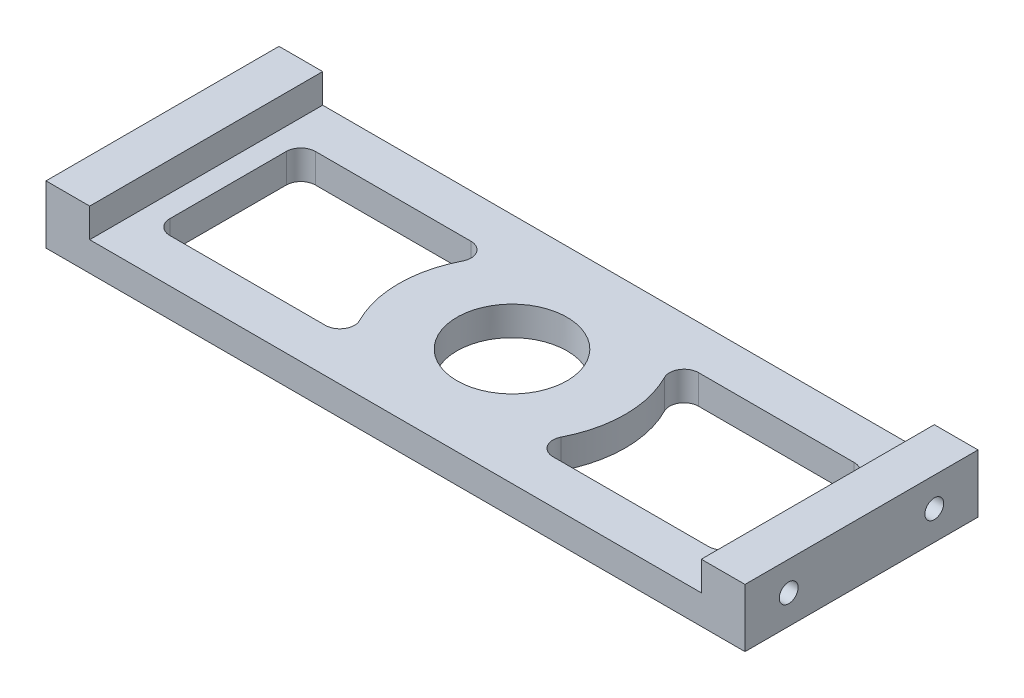
ISO-10303-21;
HEADER;
FILE_DESCRIPTION(('STEP AP214'),'2;1');
FILE_NAME('part.step','',(''),(''),'','','');
FILE_SCHEMA(('AUTOMOTIVE_DESIGN { 1 0 10303 214 1 1 1 1 }'));
ENDSEC;
DATA;
#1=APPLICATION_CONTEXT('core data for automotive mechanical design processes');
#2=APPLICATION_PROTOCOL_DEFINITION('international standard','automotive_design',2000,#1);
#3=PRODUCT_CONTEXT('',#1,'mechanical');
#4=PRODUCT('Part','Part','',(#3));
#5=PRODUCT_RELATED_PRODUCT_CATEGORY('part','',(#4));
#6=PRODUCT_DEFINITION_FORMATION('','',#4);
#7=PRODUCT_DEFINITION_CONTEXT('part definition',#1,'design');
#8=PRODUCT_DEFINITION('design','',#6,#7);
#9=PRODUCT_DEFINITION_SHAPE('','',#8);
#10=(LENGTH_UNIT() NAMED_UNIT(*) SI_UNIT(.MILLI.,.METRE.));
#11=(NAMED_UNIT(*) PLANE_ANGLE_UNIT() SI_UNIT($,.RADIAN.));
#12=(NAMED_UNIT(*) SI_UNIT($,.STERADIAN.) SOLID_ANGLE_UNIT());
#13=UNCERTAINTY_MEASURE_WITH_UNIT(LENGTH_MEASURE(1.E-05),#10,'distance_accuracy_value','');
#14=(GEOMETRIC_REPRESENTATION_CONTEXT(3) GLOBAL_UNCERTAINTY_ASSIGNED_CONTEXT((#13)) GLOBAL_UNIT_ASSIGNED_CONTEXT((#10,
#11,#12)) REPRESENTATION_CONTEXT('',''));
#15=CARTESIAN_POINT('',(0.,0.,0.));
#16=DIRECTION('',(0.,0.,1.));
#17=DIRECTION('',(1.,0.,0.));
#18=AXIS2_PLACEMENT_3D('',#15,#16,#17);
#19=CARTESIAN_POINT('',(0.,1.5875,0.));
#20=DIRECTION('',(0.,-1.,0.));
#21=DIRECTION('',(0.,0.,-1.));
#22=AXIS2_PLACEMENT_3D('',#19,#20,#21);
#23=PLANE('',#22);
#24=DIRECTION('',(1.,0.,0.));
#25=VECTOR('',#24,1.);
#26=CARTESIAN_POINT('',(-38.1,1.5875,12.7));
#27=LINE('',#26,#25);
#28=CARTESIAN_POINT('',(-33.3375,1.5875,12.7));
#29=VERTEX_POINT('',#28);
#30=CARTESIAN_POINT('',(33.3375,1.5875,12.7));
#31=VERTEX_POINT('',#30);
#32=EDGE_CURVE('E322',#29,#31,#27,.T.);
#33=ORIENTED_EDGE('',*,*,#32,.T.);
#34=DIRECTION('',(0.,0.,-1.));
#35=VECTOR('',#34,1.);
#36=CARTESIAN_POINT('',(33.3375,1.5875,-12.7));
#37=LINE('',#36,#35);
#38=CARTESIAN_POINT('',(33.3375,1.5875,-12.7));
#39=VERTEX_POINT('',#38);
#40=EDGE_CURVE('E257',#31,#39,#37,.T.);
#41=ORIENTED_EDGE('',*,*,#40,.T.);
#42=DIRECTION('',(1.,0.,0.));
#43=VECTOR('',#42,1.);
#44=CARTESIAN_POINT('',(-38.1,1.5875,-12.7));
#45=LINE('',#44,#43);
#46=CARTESIAN_POINT('',(-33.3375,1.5875,-12.7));
#47=VERTEX_POINT('',#46);
#48=EDGE_CURVE('E318',#47,#39,#45,.T.);
#49=ORIENTED_EDGE('',*,*,#48,.F.);
#50=DIRECTION('',(0.,0.,-1.));
#51=VECTOR('',#50,1.);
#52=CARTESIAN_POINT('',(-33.3375,1.5875,-12.7));
#53=LINE('',#52,#51);
#54=EDGE_CURVE('E283',#29,#47,#53,.T.);
#55=ORIENTED_EDGE('',*,*,#54,.F.);
#56=EDGE_LOOP('',(#33,#41,#49,#55));
#57=FACE_BOUND('',#56,.T.);
#58=CARTESIAN_POINT('',(0.,1.5875,0.));
#59=DIRECTION('',(0.,1.,0.));
#60=DIRECTION('',(0.,0.,1.));
#61=AXIS2_PLACEMENT_3D('',#58,#59,#60);
#62=CIRCLE('',#61,5.99999999999999);
#63=CARTESIAN_POINT('',(0.,1.5875,5.99999999999999));
#64=VERTEX_POINT('',#63);
#65=EDGE_CURVE('E309',#64,#64,#62,.T.);
#66=ORIENTED_EDGE('',*,*,#65,.F.);
#67=EDGE_LOOP('',(#66));
#68=FACE_BOUND('',#67,.T.);
#69=DIRECTION('',(0.,0.,1.));
#70=VECTOR('',#69,1.);
#71=CARTESIAN_POINT('',(-30.95625,1.5875,-7.9375));
#72=LINE('',#71,#70);
#73=CARTESIAN_POINT('',(-30.95625,1.5875,-6.35));
#74=VERTEX_POINT('',#73);
#75=CARTESIAN_POINT('',(-30.95625,1.5875,6.35));
#76=VERTEX_POINT('',#75);
#77=EDGE_CURVE('E456',#74,#76,#72,.T.);
#78=ORIENTED_EDGE('',*,*,#77,.F.);
#79=CARTESIAN_POINT('',(-29.36875,1.5875,-6.35));
#80=DIRECTION('',(0.,-1.,0.));
#81=DIRECTION('',(0.,0.,-1.));
#82=AXIS2_PLACEMENT_3D('',#79,#80,#81);
#83=CIRCLE('',#82,1.5875);
#84=CARTESIAN_POINT('',(-29.36875,1.5875,-7.9375));
#85=VERTEX_POINT('',#84);
#86=EDGE_CURVE('E51',#74,#85,#83,.T.);
#87=ORIENTED_EDGE('',*,*,#86,.T.);
#88=DIRECTION('',(-1.,0.,0.));
#89=VECTOR('',#88,1.);
#90=CARTESIAN_POINT('',(-30.95625,1.5875,-7.9375));
#91=LINE('',#90,#89);
#92=CARTESIAN_POINT('',(-12.4069096172254,1.5875,-7.9375));
#93=VERTEX_POINT('',#92);
#94=EDGE_CURVE('E455',#93,#85,#91,.T.);
#95=ORIENTED_EDGE('',*,*,#94,.F.);
#96=CARTESIAN_POINT('',(-12.4069096172254,1.5875,-6.35));
#97=DIRECTION('',(0.,-1.,0.));
#98=DIRECTION('',(0.,0.,-1.));
#99=AXIS2_PLACEMENT_3D('',#96,#97,#98);
#100=CIRCLE('',#99,1.5875);
#101=CARTESIAN_POINT('',(-10.9937459209136,1.5875,-5.6267264573991));
#102=VERTEX_POINT('',#101);
#103=EDGE_CURVE('E408',#93,#102,#100,.T.);
#104=ORIENTED_EDGE('',*,*,#103,.T.);
#105=CARTESIAN_POINT('',(0.,1.5875,0.));
#106=DIRECTION('',(0.,-1.,0.));
#107=DIRECTION('',(0.,0.,1.));
#108=AXIS2_PLACEMENT_3D('',#105,#106,#107);
#109=CIRCLE('',#108,12.35);
#110=CARTESIAN_POINT('',(-10.9937459209136,1.5875,5.6267264573991));
#111=VERTEX_POINT('',#110);
#112=EDGE_CURVE('E478',#111,#102,#109,.T.);
#113=ORIENTED_EDGE('',*,*,#112,.F.);
#114=CARTESIAN_POINT('',(-12.4069096172254,1.5875,6.35));
#115=DIRECTION('',(0.,-1.,0.));
#116=DIRECTION('',(0.,0.,-1.));
#117=AXIS2_PLACEMENT_3D('',#114,#115,#116);
#118=CIRCLE('',#117,1.5875);
#119=CARTESIAN_POINT('',(-12.4069096172254,1.5875,7.9375));
#120=VERTEX_POINT('',#119);
#121=EDGE_CURVE('E414',#111,#120,#118,.T.);
#122=ORIENTED_EDGE('',*,*,#121,.T.);
#123=DIRECTION('',(1.,0.,0.));
#124=VECTOR('',#123,1.);
#125=CARTESIAN_POINT('',(-30.95625,1.5875,7.9375));
#126=LINE('',#125,#124);
#127=CARTESIAN_POINT('',(-29.36875,1.5875,7.9375));
#128=VERTEX_POINT('',#127);
#129=EDGE_CURVE('E487',#128,#120,#126,.T.);
#130=ORIENTED_EDGE('',*,*,#129,.F.);
#131=CARTESIAN_POINT('',(-29.36875,1.5875,6.35));
#132=DIRECTION('',(0.,-1.,0.));
#133=DIRECTION('',(0.,0.,-1.));
#134=AXIS2_PLACEMENT_3D('',#131,#132,#133);
#135=CIRCLE('',#134,1.5875);
#136=EDGE_CURVE('E444',#128,#76,#135,.T.);
#137=ORIENTED_EDGE('',*,*,#136,.T.);
#138=EDGE_LOOP('',(#78,#87,#95,#104,#113,#122,#130,#137));
#139=FACE_BOUND('',#138,.T.);
#140=CARTESIAN_POINT('',(0.,1.5875,0.));
#141=DIRECTION('',(0.,1.,0.));
#142=DIRECTION('',(0.,0.,1.));
#143=AXIS2_PLACEMENT_3D('',#140,#141,#142);
#144=CIRCLE('',#143,12.35);
#145=CARTESIAN_POINT('',(10.9937459209136,1.5875,5.6267264573991));
#146=VERTEX_POINT('',#145);
#147=CARTESIAN_POINT('',(10.9937459209136,1.5875,-5.6267264573991));
#148=VERTEX_POINT('',#147);
#149=EDGE_CURVE('E602',#146,#148,#144,.T.);
#150=ORIENTED_EDGE('',*,*,#149,.T.);
#151=CARTESIAN_POINT('',(12.4069096172254,1.5875,-6.35));
#152=DIRECTION('',(0.,-1.,0.));
#153=DIRECTION('',(0.,0.,-1.));
#154=AXIS2_PLACEMENT_3D('',#151,#152,#153);
#155=CIRCLE('',#154,1.5875);
#156=CARTESIAN_POINT('',(12.4069096172254,1.5875,-7.9375));
#157=VERTEX_POINT('',#156);
#158=EDGE_CURVE('E432',#148,#157,#155,.T.);
#159=ORIENTED_EDGE('',*,*,#158,.T.);
#160=DIRECTION('',(1.,0.,0.));
#161=VECTOR('',#160,1.);
#162=CARTESIAN_POINT('',(30.95625,1.5875,-7.9375));
#163=LINE('',#162,#161);
#164=CARTESIAN_POINT('',(29.36875,1.5875,-7.9375));
#165=VERTEX_POINT('',#164);
#166=EDGE_CURVE('E598',#157,#165,#163,.T.);
#167=ORIENTED_EDGE('',*,*,#166,.T.);
#168=CARTESIAN_POINT('',(29.36875,1.5875,-6.35));
#169=DIRECTION('',(0.,-1.,0.));
#170=DIRECTION('',(0.,0.,-1.));
#171=AXIS2_PLACEMENT_3D('',#168,#169,#170);
#172=CIRCLE('',#171,1.5875);
#173=CARTESIAN_POINT('',(30.95625,1.5875,-6.35));
#174=VERTEX_POINT('',#173);
#175=EDGE_CURVE('E426',#165,#174,#172,.T.);
#176=ORIENTED_EDGE('',*,*,#175,.T.);
#177=DIRECTION('',(0.,0.,1.));
#178=VECTOR('',#177,1.);
#179=CARTESIAN_POINT('',(30.95625,1.5875,-7.9375));
#180=LINE('',#179,#178);
#181=CARTESIAN_POINT('',(30.95625,1.5875,6.35));
#182=VERTEX_POINT('',#181);
#183=EDGE_CURVE('E592',#174,#182,#180,.T.);
#184=ORIENTED_EDGE('',*,*,#183,.T.);
#185=CARTESIAN_POINT('',(29.36875,1.5875,6.35));
#186=DIRECTION('',(0.,-1.,0.));
#187=DIRECTION('',(0.,0.,-1.));
#188=AXIS2_PLACEMENT_3D('',#185,#186,#187);
#189=CIRCLE('',#188,1.5875);
#190=CARTESIAN_POINT('',(29.36875,1.5875,7.9375));
#191=VERTEX_POINT('',#190);
#192=EDGE_CURVE('E420',#182,#191,#189,.T.);
#193=ORIENTED_EDGE('',*,*,#192,.T.);
#194=DIRECTION('',(-1.,0.,0.));
#195=VECTOR('',#194,1.);
#196=CARTESIAN_POINT('',(30.95625,1.5875,7.9375));
#197=LINE('',#196,#195);
#198=CARTESIAN_POINT('',(12.4069096172254,1.5875,7.9375));
#199=VERTEX_POINT('',#198);
#200=EDGE_CURVE('E605',#191,#199,#197,.T.);
#201=ORIENTED_EDGE('',*,*,#200,.T.);
#202=CARTESIAN_POINT('',(12.4069096172254,1.5875,6.35));
#203=DIRECTION('',(0.,-1.,0.));
#204=DIRECTION('',(0.,0.,-1.));
#205=AXIS2_PLACEMENT_3D('',#202,#203,#204);
#206=CIRCLE('',#205,1.5875);
#207=EDGE_CURVE('E438',#199,#146,#206,.T.);
#208=ORIENTED_EDGE('',*,*,#207,.T.);
#209=EDGE_LOOP('',(#150,#159,#167,#176,#184,#193,#201,#208));
#210=FACE_BOUND('',#209,.T.);
#211=ADVANCED_FACE('F42',(#57,#68,#139,#210),#23,.F.);
#212=CARTESIAN_POINT('',(0.,-1.5875,0.));
#213=DIRECTION('',(0.,-1.,0.));
#214=DIRECTION('',(0.,0.,-1.));
#215=AXIS2_PLACEMENT_3D('',#212,#213,#214);
#216=PLANE('',#215);
#217=CARTESIAN_POINT('',(0.,-1.5875,0.));
#218=DIRECTION('',(0.,-1.,0.));
#219=DIRECTION('',(0.,0.,1.));
#220=AXIS2_PLACEMENT_3D('',#217,#218,#219);
#221=CIRCLE('',#220,12.35);
#222=CARTESIAN_POINT('',(-10.9937459209136,-1.5875,5.6267264573991));
#223=VERTEX_POINT('',#222);
#224=CARTESIAN_POINT('',(-10.9937459209136,-1.5875,-5.6267264573991));
#225=VERTEX_POINT('',#224);
#226=EDGE_CURVE('E234',#223,#225,#221,.T.);
#227=ORIENTED_EDGE('',*,*,#226,.T.);
#228=CARTESIAN_POINT('',(-12.4069096172254,-1.5875,-6.35));
#229=DIRECTION('',(0.,-1.,0.));
#230=DIRECTION('',(0.,0.,-1.));
#231=AXIS2_PLACEMENT_3D('',#228,#229,#230);
#232=CIRCLE('',#231,1.5875);
#233=CARTESIAN_POINT('',(-12.4069096172254,-1.5875,-7.9375));
#234=VERTEX_POINT('',#233);
#235=EDGE_CURVE('E411',#225,#234,#232,.F.);
#236=ORIENTED_EDGE('',*,*,#235,.T.);
#237=DIRECTION('',(-1.,0.,0.));
#238=VECTOR('',#237,1.);
#239=CARTESIAN_POINT('',(-30.95625,-1.5875,-7.9375));
#240=LINE('',#239,#238);
#241=CARTESIAN_POINT('',(-29.36875,-1.5875,-7.9375));
#242=VERTEX_POINT('',#241);
#243=EDGE_CURVE('E472',#234,#242,#240,.T.);
#244=ORIENTED_EDGE('',*,*,#243,.T.);
#245=CARTESIAN_POINT('',(-29.36875,-1.5875,-6.35));
#246=DIRECTION('',(0.,-1.,0.));
#247=DIRECTION('',(0.,0.,-1.));
#248=AXIS2_PLACEMENT_3D('',#245,#246,#247);
#249=CIRCLE('',#248,1.5875);
#250=CARTESIAN_POINT('',(-30.95625,-1.5875,-6.35));
#251=VERTEX_POINT('',#250);
#252=EDGE_CURVE('E11',#242,#251,#249,.F.);
#253=ORIENTED_EDGE('',*,*,#252,.T.);
#254=DIRECTION('',(0.,0.,1.));
#255=VECTOR('',#254,1.);
#256=CARTESIAN_POINT('',(-30.95625,-1.5875,-7.9375));
#257=LINE('',#256,#255);
#258=CARTESIAN_POINT('',(-30.95625,-1.5875,6.35));
#259=VERTEX_POINT('',#258);
#260=EDGE_CURVE('E468',#251,#259,#257,.T.);
#261=ORIENTED_EDGE('',*,*,#260,.T.);
#262=CARTESIAN_POINT('',(-29.36875,-1.5875,6.35));
#263=DIRECTION('',(0.,-1.,0.));
#264=DIRECTION('',(0.,0.,-1.));
#265=AXIS2_PLACEMENT_3D('',#262,#263,#264);
#266=CIRCLE('',#265,1.5875);
#267=CARTESIAN_POINT('',(-29.36875,-1.5875,7.9375));
#268=VERTEX_POINT('',#267);
#269=EDGE_CURVE('E447',#259,#268,#266,.F.);
#270=ORIENTED_EDGE('',*,*,#269,.T.);
#271=DIRECTION('',(1.,0.,0.));
#272=VECTOR('',#271,1.);
#273=CARTESIAN_POINT('',(-30.95625,-1.5875,7.9375));
#274=LINE('',#273,#272);
#275=CARTESIAN_POINT('',(-12.4069096172254,-1.5875,7.9375));
#276=VERTEX_POINT('',#275);
#277=EDGE_CURVE('E471',#268,#276,#274,.T.);
#278=ORIENTED_EDGE('',*,*,#277,.T.);
#279=CARTESIAN_POINT('',(-12.4069096172254,-1.5875,6.35));
#280=DIRECTION('',(0.,-1.,0.));
#281=DIRECTION('',(0.,0.,-1.));
#282=AXIS2_PLACEMENT_3D('',#279,#280,#281);
#283=CIRCLE('',#282,1.5875);
#284=EDGE_CURVE('E417',#276,#223,#283,.F.);
#285=ORIENTED_EDGE('',*,*,#284,.T.);
#286=EDGE_LOOP('',(#227,#236,#244,#253,#261,#270,#278,#285));
#287=FACE_BOUND('',#286,.T.);
#288=CARTESIAN_POINT('',(0.,-1.5875,0.));
#289=DIRECTION('',(0.,-1.,0.));
#290=DIRECTION('',(0.,0.,-1.));
#291=AXIS2_PLACEMENT_3D('',#288,#289,#290);
#292=CIRCLE('',#291,5.99999999999999);
#293=CARTESIAN_POINT('',(0.,-1.5875,-5.99999999999999));
#294=VERTEX_POINT('',#293);
#295=EDGE_CURVE('E313',#294,#294,#292,.T.);
#296=ORIENTED_EDGE('',*,*,#295,.F.);
#297=EDGE_LOOP('',(#296));
#298=FACE_BOUND('',#297,.T.);
#299=DIRECTION('',(0.,0.,-1.));
#300=VECTOR('',#299,1.);
#301=CARTESIAN_POINT('',(-38.1,-1.5875,12.7));
#302=LINE('',#301,#300);
#303=CARTESIAN_POINT('',(-38.1,-1.5875,12.7));
#304=VERTEX_POINT('',#303);
#305=CARTESIAN_POINT('',(-38.1,-1.5875,-12.7));
#306=VERTEX_POINT('',#305);
#307=EDGE_CURVE('E317',#304,#306,#302,.T.);
#308=ORIENTED_EDGE('',*,*,#307,.T.);
#309=DIRECTION('',(1.,0.,0.));
#310=VECTOR('',#309,1.);
#311=CARTESIAN_POINT('',(-38.1,-1.5875,-12.7));
#312=LINE('',#311,#310);
#313=CARTESIAN_POINT('',(38.1,-1.5875,-12.7));
#314=VERTEX_POINT('',#313);
#315=EDGE_CURVE('E331',#306,#314,#312,.T.);
#316=ORIENTED_EDGE('',*,*,#315,.T.);
#317=DIRECTION('',(0.,0.,-1.));
#318=VECTOR('',#317,1.);
#319=CARTESIAN_POINT('',(38.1,-1.5875,12.7));
#320=LINE('',#319,#318);
#321=CARTESIAN_POINT('',(38.1,-1.5875,12.7));
#322=VERTEX_POINT('',#321);
#323=EDGE_CURVE('E335',#322,#314,#320,.T.);
#324=ORIENTED_EDGE('',*,*,#323,.F.);
#325=DIRECTION('',(1.,0.,0.));
#326=VECTOR('',#325,1.);
#327=CARTESIAN_POINT('',(-38.1,-1.5875,12.7));
#328=LINE('',#327,#326);
#329=EDGE_CURVE('E323',#304,#322,#328,.T.);
#330=ORIENTED_EDGE('',*,*,#329,.F.);
#331=EDGE_LOOP('',(#308,#316,#324,#330));
#332=FACE_BOUND('',#331,.T.);
#333=DIRECTION('',(0.,0.,1.));
#334=VECTOR('',#333,1.);
#335=CARTESIAN_POINT('',(30.95625,-1.5875,-7.9375));
#336=LINE('',#335,#334);
#337=CARTESIAN_POINT('',(30.95625,-1.5875,-6.35));
#338=VERTEX_POINT('',#337);
#339=CARTESIAN_POINT('',(30.95625,-1.5875,6.35));
#340=VERTEX_POINT('',#339);
#341=EDGE_CURVE('E465',#338,#340,#336,.T.);
#342=ORIENTED_EDGE('',*,*,#341,.F.);
#343=CARTESIAN_POINT('',(29.36875,-1.5875,-6.35));
#344=DIRECTION('',(0.,-1.,0.));
#345=DIRECTION('',(0.,0.,-1.));
#346=AXIS2_PLACEMENT_3D('',#343,#344,#345);
#347=CIRCLE('',#346,1.5875);
#348=CARTESIAN_POINT('',(29.36875,-1.5875,-7.9375));
#349=VERTEX_POINT('',#348);
#350=EDGE_CURVE('E429',#338,#349,#347,.F.);
#351=ORIENTED_EDGE('',*,*,#350,.T.);
#352=DIRECTION('',(1.,0.,0.));
#353=VECTOR('',#352,1.);
#354=CARTESIAN_POINT('',(30.95625,-1.5875,-7.9375));
#355=LINE('',#354,#353);
#356=CARTESIAN_POINT('',(12.4069096172254,-1.5875,-7.9375));
#357=VERTEX_POINT('',#356);
#358=EDGE_CURVE('E580',#357,#349,#355,.T.);
#359=ORIENTED_EDGE('',*,*,#358,.F.);
#360=CARTESIAN_POINT('',(12.4069096172254,-1.5875,-6.35));
#361=DIRECTION('',(0.,-1.,0.));
#362=DIRECTION('',(0.,0.,-1.));
#363=AXIS2_PLACEMENT_3D('',#360,#361,#362);
#364=CIRCLE('',#363,1.5875);
#365=CARTESIAN_POINT('',(10.9937459209136,-1.5875,-5.6267264573991));
#366=VERTEX_POINT('',#365);
#367=EDGE_CURVE('E435',#357,#366,#364,.F.);
#368=ORIENTED_EDGE('',*,*,#367,.T.);
#369=CARTESIAN_POINT('',(0.,-1.5875,0.));
#370=DIRECTION('',(0.,1.,0.));
#371=DIRECTION('',(0.,0.,1.));
#372=AXIS2_PLACEMENT_3D('',#369,#370,#371);
#373=CIRCLE('',#372,12.35);
#374=CARTESIAN_POINT('',(10.9937459209136,-1.5875,5.6267264573991));
#375=VERTEX_POINT('',#374);
#376=EDGE_CURVE('E577',#375,#366,#373,.T.);
#377=ORIENTED_EDGE('',*,*,#376,.F.);
#378=CARTESIAN_POINT('',(12.4069096172254,-1.5875,6.35));
#379=DIRECTION('',(0.,-1.,0.));
#380=DIRECTION('',(0.,0.,-1.));
#381=AXIS2_PLACEMENT_3D('',#378,#379,#380);
#382=CIRCLE('',#381,1.5875);
#383=CARTESIAN_POINT('',(12.4069096172254,-1.5875,7.9375));
#384=VERTEX_POINT('',#383);
#385=EDGE_CURVE('E441',#375,#384,#382,.F.);
#386=ORIENTED_EDGE('',*,*,#385,.T.);
#387=DIRECTION('',(-1.,0.,0.));
#388=VECTOR('',#387,1.);
#389=CARTESIAN_POINT('',(30.95625,-1.5875,7.9375));
#390=LINE('',#389,#388);
#391=CARTESIAN_POINT('',(29.36875,-1.5875,7.9375));
#392=VERTEX_POINT('',#391);
#393=EDGE_CURVE('E586',#392,#384,#390,.T.);
#394=ORIENTED_EDGE('',*,*,#393,.F.);
#395=CARTESIAN_POINT('',(29.36875,-1.5875,6.35));
#396=DIRECTION('',(0.,-1.,0.));
#397=DIRECTION('',(0.,0.,-1.));
#398=AXIS2_PLACEMENT_3D('',#395,#396,#397);
#399=CIRCLE('',#398,1.5875);
#400=EDGE_CURVE('E423',#392,#340,#399,.F.);
#401=ORIENTED_EDGE('',*,*,#400,.T.);
#402=EDGE_LOOP('',(#342,#351,#359,#368,#377,#386,#394,#401));
#403=FACE_BOUND('',#402,.T.);
#404=ADVANCED_FACE('F501',(#287,#298,#332,#403),#216,.T.);
#405=CARTESIAN_POINT('',(38.1,1.5875,12.7));
#406=DIRECTION('',(-1.,0.,0.));
#407=DIRECTION('',(0.,0.,1.));
#408=AXIS2_PLACEMENT_3D('',#405,#406,#407);
#409=PLANE('',#408);
#410=ORIENTED_EDGE('',*,*,#323,.T.);
#411=DIRECTION('',(0.,-1.,0.));
#412=VECTOR('',#411,1.);
#413=CARTESIAN_POINT('',(38.1,1.5875,-12.7));
#414=LINE('',#413,#412);
#415=CARTESIAN_POINT('',(38.1,4.7625,-12.7));
#416=VERTEX_POINT('',#415);
#417=EDGE_CURVE('E349',#416,#314,#414,.T.);
#418=ORIENTED_EDGE('',*,*,#417,.F.);
#419=DIRECTION('',(0.,0.,1.));
#420=VECTOR('',#419,1.);
#421=CARTESIAN_POINT('',(38.1,4.7625,-12.7));
#422=LINE('',#421,#420);
#423=CARTESIAN_POINT('',(38.1,4.7625,12.7));
#424=VERTEX_POINT('',#423);
#425=EDGE_CURVE('E258',#416,#424,#422,.T.);
#426=ORIENTED_EDGE('',*,*,#425,.T.);
#427=DIRECTION('',(0.,-1.,0.));
#428=VECTOR('',#427,1.);
#429=CARTESIAN_POINT('',(38.1,1.5875,12.7));
#430=LINE('',#429,#428);
#431=EDGE_CURVE('E345',#424,#322,#430,.T.);
#432=ORIENTED_EDGE('',*,*,#431,.T.);
#433=EDGE_LOOP('',(#410,#418,#426,#432));
#434=FACE_BOUND('',#433,.T.);
#435=CARTESIAN_POINT('',(38.1,1.58750000000218,-7.9375000000005));
#436=DIRECTION('',(1.,0.,0.));
#437=DIRECTION('',(0.,0.,-1.));
#438=AXIS2_PLACEMENT_3D('',#435,#436,#437);
#439=CIRCLE('',#438,1.02499999999999);
#440=CARTESIAN_POINT('',(38.1,1.58750000000218,-8.96250000000049));
#441=VERTEX_POINT('',#440);
#442=EDGE_CURVE('E225',#441,#441,#439,.T.);
#443=ORIENTED_EDGE('',*,*,#442,.F.);
#444=EDGE_LOOP('',(#443));
#445=FACE_BOUND('',#444,.T.);
#446=CARTESIAN_POINT('',(38.1,1.58750000000215,7.9374999999995));
#447=DIRECTION('',(1.,0.,0.));
#448=DIRECTION('',(0.,0.,-1.));
#449=AXIS2_PLACEMENT_3D('',#446,#447,#448);
#450=CIRCLE('',#449,1.02499999999999);
#451=CARTESIAN_POINT('',(38.1,1.58750000000215,6.91249999999951));
#452=VERTEX_POINT('',#451);
#453=EDGE_CURVE('E226',#452,#452,#450,.T.);
#454=ORIENTED_EDGE('',*,*,#453,.F.);
#455=EDGE_LOOP('',(#454));
#456=FACE_BOUND('',#455,.T.);
#457=ADVANCED_FACE('F530',(#434,#445,#456),#409,.F.);
#458=CARTESIAN_POINT('',(-38.1,1.5875,12.7));
#459=DIRECTION('',(-1.,0.,0.));
#460=DIRECTION('',(0.,0.,1.));
#461=AXIS2_PLACEMENT_3D('',#458,#459,#460);
#462=PLANE('',#461);
#463=CARTESIAN_POINT('',(-38.1,1.5875,7.93749999999999));
#464=DIRECTION('',(-1.,0.,0.));
#465=DIRECTION('',(0.,0.,1.));
#466=AXIS2_PLACEMENT_3D('',#463,#464,#465);
#467=CIRCLE('',#466,1.02499999999999);
#468=CARTESIAN_POINT('',(-38.1,1.5875,8.96249999999998));
#469=VERTEX_POINT('',#468);
#470=EDGE_CURVE('E241',#469,#469,#467,.T.);
#471=ORIENTED_EDGE('',*,*,#470,.F.);
#472=EDGE_LOOP('',(#471));
#473=FACE_BOUND('',#472,.T.);
#474=CARTESIAN_POINT('',(-38.1,1.5875,-7.93750000000001));
#475=DIRECTION('',(-1.,0.,0.));
#476=DIRECTION('',(0.,0.,1.));
#477=AXIS2_PLACEMENT_3D('',#474,#475,#476);
#478=CIRCLE('',#477,1.02499999999999);
#479=CARTESIAN_POINT('',(-38.1,1.5875,-6.91250000000002));
#480=VERTEX_POINT('',#479);
#481=EDGE_CURVE('E249',#480,#480,#478,.T.);
#482=ORIENTED_EDGE('',*,*,#481,.F.);
#483=EDGE_LOOP('',(#482));
#484=FACE_BOUND('',#483,.T.);
#485=ORIENTED_EDGE('',*,*,#307,.F.);
#486=DIRECTION('',(0.,-1.,0.));
#487=VECTOR('',#486,1.);
#488=CARTESIAN_POINT('',(-38.1,1.5875,12.7));
#489=LINE('',#488,#487);
#490=CARTESIAN_POINT('',(-38.1,4.7625,12.7));
#491=VERTEX_POINT('',#490);
#492=EDGE_CURVE('E341',#491,#304,#489,.T.);
#493=ORIENTED_EDGE('',*,*,#492,.F.);
#494=DIRECTION('',(0.,0.,1.));
#495=VECTOR('',#494,1.);
#496=CARTESIAN_POINT('',(-38.1,4.7625,-12.7));
#497=LINE('',#496,#495);
#498=CARTESIAN_POINT('',(-38.1,4.7625,-12.7));
#499=VERTEX_POINT('',#498);
#500=EDGE_CURVE('E284',#499,#491,#497,.T.);
#501=ORIENTED_EDGE('',*,*,#500,.F.);
#502=DIRECTION('',(0.,-1.,0.));
#503=VECTOR('',#502,1.);
#504=CARTESIAN_POINT('',(-38.1,1.5875,-12.7));
#505=LINE('',#504,#503);
#506=EDGE_CURVE('E327',#499,#306,#505,.T.);
#507=ORIENTED_EDGE('',*,*,#506,.T.);
#508=EDGE_LOOP('',(#485,#493,#501,#507));
#509=FACE_BOUND('',#508,.T.);
#510=ADVANCED_FACE('F541',(#473,#484,#509),#462,.T.);
#511=CARTESIAN_POINT('',(-38.1,1.5875,12.7));
#512=DIRECTION('',(0.,0.,-1.));
#513=DIRECTION('',(-1.,0.,0.));
#514=AXIS2_PLACEMENT_3D('',#511,#512,#513);
#515=PLANE('',#514);
#516=ORIENTED_EDGE('',*,*,#329,.T.);
#517=ORIENTED_EDGE('',*,*,#431,.F.);
#518=DIRECTION('',(-1.,0.,0.));
#519=VECTOR('',#518,1.);
#520=CARTESIAN_POINT('',(38.1,4.7625,12.7));
#521=LINE('',#520,#519);
#522=CARTESIAN_POINT('',(33.3375,4.7625,12.7));
#523=VERTEX_POINT('',#522);
#524=EDGE_CURVE('E270',#424,#523,#521,.T.);
#525=ORIENTED_EDGE('',*,*,#524,.T.);
#526=DIRECTION('',(0.,-1.,0.));
#527=VECTOR('',#526,1.);
#528=CARTESIAN_POINT('',(33.3375,4.7625,12.7));
#529=LINE('',#528,#527);
#530=EDGE_CURVE('E274',#523,#31,#529,.T.);
#531=ORIENTED_EDGE('',*,*,#530,.T.);
#532=ORIENTED_EDGE('',*,*,#32,.F.);
#533=DIRECTION('',(0.,-1.,0.));
#534=VECTOR('',#533,1.);
#535=CARTESIAN_POINT('',(-33.3375,4.7625,12.7));
#536=LINE('',#535,#534);
#537=CARTESIAN_POINT('',(-33.3375,4.7625,12.7));
#538=VERTEX_POINT('',#537);
#539=EDGE_CURVE('E305',#538,#29,#536,.T.);
#540=ORIENTED_EDGE('',*,*,#539,.F.);
#541=DIRECTION('',(1.,0.,0.));
#542=VECTOR('',#541,1.);
#543=CARTESIAN_POINT('',(-38.1,4.7625,12.7));
#544=LINE('',#543,#542);
#545=EDGE_CURVE('E288',#491,#538,#544,.T.);
#546=ORIENTED_EDGE('',*,*,#545,.F.);
#547=ORIENTED_EDGE('',*,*,#492,.T.);
#548=EDGE_LOOP('',(#516,#517,#525,#531,#532,#540,#546,#547));
#549=FACE_BOUND('',#548,.T.);
#550=ADVANCED_FACE('F537',(#549),#515,.F.);
#551=CARTESIAN_POINT('',(-38.1,1.5875,-12.7));
#552=DIRECTION('',(0.,0.,-1.));
#553=DIRECTION('',(-1.,0.,0.));
#554=AXIS2_PLACEMENT_3D('',#551,#552,#553);
#555=PLANE('',#554);
#556=ORIENTED_EDGE('',*,*,#315,.F.);
#557=ORIENTED_EDGE('',*,*,#506,.F.);
#558=DIRECTION('',(-1.,0.,0.));
#559=VECTOR('',#558,1.);
#560=CARTESIAN_POINT('',(-38.1,4.7625,-12.7));
#561=LINE('',#560,#559);
#562=CARTESIAN_POINT('',(-33.3375,4.7625,-12.7));
#563=VERTEX_POINT('',#562);
#564=EDGE_CURVE('E294',#563,#499,#561,.T.);
#565=ORIENTED_EDGE('',*,*,#564,.F.);
#566=DIRECTION('',(0.,-1.,0.));
#567=VECTOR('',#566,1.);
#568=CARTESIAN_POINT('',(-33.3375,4.7625,-12.7));
#569=LINE('',#568,#567);
#570=EDGE_CURVE('E298',#563,#47,#569,.T.);
#571=ORIENTED_EDGE('',*,*,#570,.T.);
#572=ORIENTED_EDGE('',*,*,#48,.T.);
#573=DIRECTION('',(0.,-1.,0.));
#574=VECTOR('',#573,1.);
#575=CARTESIAN_POINT('',(33.3375,4.7625,-12.7));
#576=LINE('',#575,#574);
#577=CARTESIAN_POINT('',(33.3375,4.7625,-12.7));
#578=VERTEX_POINT('',#577);
#579=EDGE_CURVE('E280',#578,#39,#576,.T.);
#580=ORIENTED_EDGE('',*,*,#579,.F.);
#581=DIRECTION('',(1.,0.,0.));
#582=VECTOR('',#581,1.);
#583=CARTESIAN_POINT('',(38.1,4.7625,-12.7));
#584=LINE('',#583,#582);
#585=EDGE_CURVE('E262',#578,#416,#584,.T.);
#586=ORIENTED_EDGE('',*,*,#585,.T.);
#587=ORIENTED_EDGE('',*,*,#417,.T.);
#588=EDGE_LOOP('',(#556,#557,#565,#571,#572,#580,#586,#587));
#589=FACE_BOUND('',#588,.T.);
#590=ADVANCED_FACE('F540',(#589),#555,.T.);
#591=CARTESIAN_POINT('',(0.,1.5875,0.));
#592=DIRECTION('',(0.,1.,0.));
#593=DIRECTION('',(0.,0.,1.));
#594=AXIS2_PLACEMENT_3D('',#591,#592,#593);
#595=CYLINDRICAL_SURFACE('',#594,5.99999999999999);
#596=ORIENTED_EDGE('',*,*,#65,.T.);
#597=EDGE_LOOP('',(#596));
#598=FACE_BOUND('',#597,.T.);
#599=ORIENTED_EDGE('',*,*,#295,.T.);
#600=EDGE_LOOP('',(#599));
#601=FACE_BOUND('',#600,.T.);
#602=ADVANCED_FACE('F534',(#598,#601),#595,.F.);
#603=CARTESIAN_POINT('',(-33.3375,4.7625,-12.7));
#604=DIRECTION('',(-1.,0.,0.));
#605=DIRECTION('',(0.,0.,1.));
#606=AXIS2_PLACEMENT_3D('',#603,#604,#605);
#607=PLANE('',#606);
#608=ORIENTED_EDGE('',*,*,#54,.T.);
#609=ORIENTED_EDGE('',*,*,#570,.F.);
#610=DIRECTION('',(0.,0.,-1.));
#611=VECTOR('',#610,1.);
#612=CARTESIAN_POINT('',(-33.3375,4.7625,-12.7));
#613=LINE('',#612,#611);
#614=EDGE_CURVE('E291',#538,#563,#613,.T.);
#615=ORIENTED_EDGE('',*,*,#614,.F.);
#616=ORIENTED_EDGE('',*,*,#539,.T.);
#617=EDGE_LOOP('',(#608,#609,#615,#616));
#618=FACE_BOUND('',#617,.T.);
#619=ADVANCED_FACE('F681',(#618),#607,.F.);
#620=CARTESIAN_POINT('',(0.,4.7625,0.));
#621=DIRECTION('',(0.,1.,0.));
#622=DIRECTION('',(0.,0.,1.));
#623=AXIS2_PLACEMENT_3D('',#620,#621,#622);
#624=PLANE('',#623);
#625=ORIENTED_EDGE('',*,*,#500,.T.);
#626=ORIENTED_EDGE('',*,*,#545,.T.);
#627=ORIENTED_EDGE('',*,*,#614,.T.);
#628=ORIENTED_EDGE('',*,*,#564,.T.);
#629=EDGE_LOOP('',(#625,#626,#627,#628));
#630=FACE_BOUND('',#629,.T.);
#631=ADVANCED_FACE('F678',(#630),#624,.T.);
#632=CARTESIAN_POINT('',(33.3375,4.7625,-12.7));
#633=DIRECTION('',(-1.,0.,0.));
#634=DIRECTION('',(0.,0.,1.));
#635=AXIS2_PLACEMENT_3D('',#632,#633,#634);
#636=PLANE('',#635);
#637=ORIENTED_EDGE('',*,*,#40,.F.);
#638=ORIENTED_EDGE('',*,*,#530,.F.);
#639=DIRECTION('',(0.,0.,-1.));
#640=VECTOR('',#639,1.);
#641=CARTESIAN_POINT('',(33.3375,4.7625,-12.7));
#642=LINE('',#641,#640);
#643=EDGE_CURVE('E266',#523,#578,#642,.T.);
#644=ORIENTED_EDGE('',*,*,#643,.T.);
#645=ORIENTED_EDGE('',*,*,#579,.T.);
#646=EDGE_LOOP('',(#637,#638,#644,#645));
#647=FACE_BOUND('',#646,.T.);
#648=ADVANCED_FACE('F674',(#647),#636,.T.);
#649=CARTESIAN_POINT('',(0.,4.7625,0.));
#650=DIRECTION('',(0.,1.,0.));
#651=DIRECTION('',(0.,0.,1.));
#652=AXIS2_PLACEMENT_3D('',#649,#650,#651);
#653=PLANE('',#652);
#654=ORIENTED_EDGE('',*,*,#425,.F.);
#655=ORIENTED_EDGE('',*,*,#585,.F.);
#656=ORIENTED_EDGE('',*,*,#643,.F.);
#657=ORIENTED_EDGE('',*,*,#524,.F.);
#658=EDGE_LOOP('',(#654,#655,#656,#657));
#659=FACE_BOUND('',#658,.T.);
#660=ADVANCED_FACE('F670',(#659),#653,.T.);
#661=CARTESIAN_POINT('',(-34.100008,1.5875,-7.93750000000001));
#662=DIRECTION('',(-1.,0.,0.));
#663=DIRECTION('',(0.,0.,1.));
#664=AXIS2_PLACEMENT_3D('',#661,#662,#663);
#665=CONICAL_SURFACE('',#664,1.025,1.02974425867666);
#666=CARTESIAN_POINT('',(-33.4841258654968,1.5875,-7.93750000000001));
#667=VERTEX_POINT('',#666);
#668=VERTEX_LOOP('',#667);
#669=FACE_BOUND('',#668,.T.);
#670=CARTESIAN_POINT('',(-34.100008,1.5875,-7.93750000000001));
#671=DIRECTION('',(-1.,0.,0.));
#672=DIRECTION('',(0.,0.,1.));
#673=AXIS2_PLACEMENT_3D('',#670,#671,#672);
#674=CIRCLE('',#673,1.025);
#675=CARTESIAN_POINT('',(-34.100008,1.5875,-6.91250000000001));
#676=VERTEX_POINT('',#675);
#677=EDGE_CURVE('E253',#676,#676,#674,.T.);
#678=ORIENTED_EDGE('',*,*,#677,.T.);
#679=EDGE_LOOP('',(#678));
#680=FACE_BOUND('',#679,.T.);
#681=ADVANCED_FACE('F666',(#669,#680),#665,.F.);
#682=CARTESIAN_POINT('',(-38.1,1.5875,-7.93750000000001));
#683=DIRECTION('',(-1.,0.,0.));
#684=DIRECTION('',(0.,0.,1.));
#685=AXIS2_PLACEMENT_3D('',#682,#683,#684);
#686=CYLINDRICAL_SURFACE('',#685,1.02499999999999);
#687=ORIENTED_EDGE('',*,*,#677,.F.);
#688=EDGE_LOOP('',(#687));
#689=FACE_BOUND('',#688,.T.);
#690=ORIENTED_EDGE('',*,*,#481,.T.);
#691=EDGE_LOOP('',(#690));
#692=FACE_BOUND('',#691,.T.);
#693=ADVANCED_FACE('F662',(#689,#692),#686,.F.);
#694=CARTESIAN_POINT('',(-34.100008,1.5875,7.93749999999999));
#695=DIRECTION('',(-1.,0.,0.));
#696=DIRECTION('',(0.,0.,1.));
#697=AXIS2_PLACEMENT_3D('',#694,#695,#696);
#698=CONICAL_SURFACE('',#697,1.025,1.02974425867666);
#699=CARTESIAN_POINT('',(-33.4841258654968,1.5875,7.93749999999999));
#700=VERTEX_POINT('',#699);
#701=VERTEX_LOOP('',#700);
#702=FACE_BOUND('',#701,.T.);
#703=CARTESIAN_POINT('',(-34.100008,1.5875,7.93749999999999));
#704=DIRECTION('',(-1.,0.,0.));
#705=DIRECTION('',(0.,0.,1.));
#706=AXIS2_PLACEMENT_3D('',#703,#704,#705);
#707=CIRCLE('',#706,1.025);
#708=CARTESIAN_POINT('',(-34.100008,1.5875,8.9625));
#709=VERTEX_POINT('',#708);
#710=EDGE_CURVE('E245',#709,#709,#707,.T.);
#711=ORIENTED_EDGE('',*,*,#710,.T.);
#712=EDGE_LOOP('',(#711));
#713=FACE_BOUND('',#712,.T.);
#714=ADVANCED_FACE('F658',(#702,#713),#698,.F.);
#715=CARTESIAN_POINT('',(-38.1,1.5875,7.93749999999999));
#716=DIRECTION('',(-1.,0.,0.));
#717=DIRECTION('',(0.,0.,1.));
#718=AXIS2_PLACEMENT_3D('',#715,#716,#717);
#719=CYLINDRICAL_SURFACE('',#718,1.02499999999999);
#720=ORIENTED_EDGE('',*,*,#710,.F.);
#721=EDGE_LOOP('',(#720));
#722=FACE_BOUND('',#721,.T.);
#723=ORIENTED_EDGE('',*,*,#470,.T.);
#724=EDGE_LOOP('',(#723));
#725=FACE_BOUND('',#724,.T.);
#726=ADVANCED_FACE('F654',(#722,#725),#719,.F.);
#727=CARTESIAN_POINT('',(34.100008,1.58750000000218,-7.9375000000005));
#728=DIRECTION('',(1.,0.,0.));
#729=DIRECTION('',(0.,0.,-1.));
#730=AXIS2_PLACEMENT_3D('',#727,#728,#729);
#731=CONICAL_SURFACE('',#730,1.025,1.02974425867665);
#732=CARTESIAN_POINT('',(33.4841258654968,1.58750000000218,-7.9375000000005));
#733=VERTEX_POINT('',#732);
#734=VERTEX_LOOP('',#733);
#735=FACE_BOUND('',#734,.T.);
#736=CARTESIAN_POINT('',(34.100008,1.58750000000218,-7.9375000000005));
#737=DIRECTION('',(1.,0.,0.));
#738=DIRECTION('',(0.,0.,-1.));
#739=AXIS2_PLACEMENT_3D('',#736,#737,#738);
#740=CIRCLE('',#739,1.025);
#741=CARTESIAN_POINT('',(34.100008,1.58750000000218,-8.96250000000049));
#742=VERTEX_POINT('',#741);
#743=EDGE_CURVE('E231',#742,#742,#740,.T.);
#744=ORIENTED_EDGE('',*,*,#743,.T.);
#745=EDGE_LOOP('',(#744));
#746=FACE_BOUND('',#745,.T.);
#747=ADVANCED_FACE('F650',(#735,#746),#731,.F.);
#748=CARTESIAN_POINT('',(38.1,1.58750000000218,-7.9375000000005));
#749=DIRECTION('',(1.,0.,0.));
#750=DIRECTION('',(0.,0.,-1.));
#751=AXIS2_PLACEMENT_3D('',#748,#749,#750);
#752=CYLINDRICAL_SURFACE('',#751,1.02499999999999);
#753=ORIENTED_EDGE('',*,*,#743,.F.);
#754=EDGE_LOOP('',(#753));
#755=FACE_BOUND('',#754,.T.);
#756=ORIENTED_EDGE('',*,*,#442,.T.);
#757=EDGE_LOOP('',(#756));
#758=FACE_BOUND('',#757,.T.);
#759=ADVANCED_FACE('F218',(#755,#758),#752,.F.);
#760=CARTESIAN_POINT('',(34.100008,1.58750000000215,7.9374999999995));
#761=DIRECTION('',(1.,0.,0.));
#762=DIRECTION('',(0.,0.,-1.));
#763=AXIS2_PLACEMENT_3D('',#760,#761,#762);
#764=CONICAL_SURFACE('',#763,1.025,1.02974425867665);
#765=CARTESIAN_POINT('',(33.4841258654968,1.58750000000215,7.9374999999995));
#766=VERTEX_POINT('',#765);
#767=VERTEX_LOOP('',#766);
#768=FACE_BOUND('',#767,.T.);
#769=CARTESIAN_POINT('',(34.100008,1.58750000000215,7.9374999999995));
#770=DIRECTION('',(1.,0.,0.));
#771=DIRECTION('',(0.,0.,-1.));
#772=AXIS2_PLACEMENT_3D('',#769,#770,#771);
#773=CIRCLE('',#772,1.025);
#774=CARTESIAN_POINT('',(34.100008,1.58750000000215,6.91249999999951));
#775=VERTEX_POINT('',#774);
#776=EDGE_CURVE('E222',#775,#775,#773,.T.);
#777=ORIENTED_EDGE('',*,*,#776,.T.);
#778=EDGE_LOOP('',(#777));
#779=FACE_BOUND('',#778,.T.);
#780=ADVANCED_FACE('F214',(#768,#779),#764,.F.);
#781=CARTESIAN_POINT('',(38.1,1.58750000000215,7.9374999999995));
#782=DIRECTION('',(1.,0.,0.));
#783=DIRECTION('',(0.,0.,-1.));
#784=AXIS2_PLACEMENT_3D('',#781,#782,#783);
#785=CYLINDRICAL_SURFACE('',#784,1.02499999999999);
#786=ORIENTED_EDGE('',*,*,#776,.F.);
#787=EDGE_LOOP('',(#786));
#788=FACE_BOUND('',#787,.T.);
#789=ORIENTED_EDGE('',*,*,#453,.T.);
#790=EDGE_LOOP('',(#789));
#791=FACE_BOUND('',#790,.T.);
#792=ADVANCED_FACE('F217',(#788,#791),#785,.F.);
#793=CARTESIAN_POINT('',(-30.95625,-1.5875,-7.9375));
#794=DIRECTION('',(0.,0.,-1.));
#795=DIRECTION('',(-1.,0.,0.));
#796=AXIS2_PLACEMENT_3D('',#793,#794,#795);
#797=PLANE('',#796);
#798=ORIENTED_EDGE('',*,*,#243,.F.);
#799=DIRECTION('',(0.,-1.,0.));
#800=VECTOR('',#799,1.);
#801=CARTESIAN_POINT('',(-12.4069096172254,1.5875,-7.9375));
#802=LINE('',#801,#800);
#803=EDGE_CURVE('E356',#234,#93,#802,.F.);
#804=ORIENTED_EDGE('',*,*,#803,.T.);
#805=ORIENTED_EDGE('',*,*,#94,.T.);
#806=DIRECTION('',(0.,1.,0.));
#807=VECTOR('',#806,1.);
#808=CARTESIAN_POINT('',(-29.36875,-1.5875,-7.9375));
#809=LINE('',#808,#807);
#810=EDGE_CURVE('E344',#85,#242,#809,.F.);
#811=ORIENTED_EDGE('',*,*,#810,.T.);
#812=EDGE_LOOP('',(#798,#804,#805,#811));
#813=FACE_BOUND('',#812,.T.);
#814=ADVANCED_FACE('F462',(#813),#797,.F.);
#815=CARTESIAN_POINT('',(0.,-1.5875,0.));
#816=DIRECTION('',(0.,1.,0.));
#817=DIRECTION('',(0.,0.,1.));
#818=AXIS2_PLACEMENT_3D('',#815,#816,#817);
#819=CYLINDRICAL_SURFACE('',#818,12.35);
#820=ORIENTED_EDGE('',*,*,#112,.T.);
#821=DIRECTION('',(0.,1.,0.));
#822=VECTOR('',#821,1.);
#823=CARTESIAN_POINT('',(-10.9937459209136,-1.5875,-5.6267264573991));
#824=LINE('',#823,#822);
#825=EDGE_CURVE('E364',#102,#225,#824,.F.);
#826=ORIENTED_EDGE('',*,*,#825,.T.);
#827=ORIENTED_EDGE('',*,*,#226,.F.);
#828=DIRECTION('',(0.,1.,0.));
#829=VECTOR('',#828,1.);
#830=CARTESIAN_POINT('',(-10.9937459209136,-1.5875,5.6267264573991));
#831=LINE('',#830,#829);
#832=EDGE_CURVE('E360',#223,#111,#831,.T.);
#833=ORIENTED_EDGE('',*,*,#832,.T.);
#834=EDGE_LOOP('',(#820,#826,#827,#833));
#835=FACE_BOUND('',#834,.T.);
#836=ADVANCED_FACE('F495',(#835),#819,.T.);
#837=CARTESIAN_POINT('',(-30.95625,-1.5875,7.9375));
#838=DIRECTION('',(0.,0.,1.));
#839=DIRECTION('',(1.,0.,0.));
#840=AXIS2_PLACEMENT_3D('',#837,#838,#839);
#841=PLANE('',#840);
#842=ORIENTED_EDGE('',*,*,#129,.T.);
#843=DIRECTION('',(0.,-1.,0.));
#844=VECTOR('',#843,1.);
#845=CARTESIAN_POINT('',(-12.4069096172254,-1.5875,7.9375));
#846=LINE('',#845,#844);
#847=EDGE_CURVE('E371',#120,#276,#846,.T.);
#848=ORIENTED_EDGE('',*,*,#847,.T.);
#849=ORIENTED_EDGE('',*,*,#277,.F.);
#850=DIRECTION('',(0.,1.,0.));
#851=VECTOR('',#850,1.);
#852=CARTESIAN_POINT('',(-29.36875,1.5875,7.9375));
#853=LINE('',#852,#851);
#854=EDGE_CURVE('E367',#268,#128,#853,.T.);
#855=ORIENTED_EDGE('',*,*,#854,.T.);
#856=EDGE_LOOP('',(#842,#848,#849,#855));
#857=FACE_BOUND('',#856,.T.);
#858=ADVANCED_FACE('F509',(#857),#841,.F.);
#859=CARTESIAN_POINT('',(-30.95625,-1.5875,-7.9375));
#860=DIRECTION('',(-1.,0.,0.));
#861=DIRECTION('',(0.,0.,1.));
#862=AXIS2_PLACEMENT_3D('',#859,#860,#861);
#863=PLANE('',#862);
#864=ORIENTED_EDGE('',*,*,#77,.T.);
#865=DIRECTION('',(0.,1.,0.));
#866=VECTOR('',#865,1.);
#867=CARTESIAN_POINT('',(-30.95625,-1.5875,6.35));
#868=LINE('',#867,#866);
#869=EDGE_CURVE('E58',#76,#259,#868,.F.);
#870=ORIENTED_EDGE('',*,*,#869,.T.);
#871=ORIENTED_EDGE('',*,*,#260,.F.);
#872=DIRECTION('',(0.,1.,0.));
#873=VECTOR('',#872,1.);
#874=CARTESIAN_POINT('',(-30.95625,1.5875,-6.35));
#875=LINE('',#874,#873);
#876=EDGE_CURVE('E402',#251,#74,#875,.T.);
#877=ORIENTED_EDGE('',*,*,#876,.T.);
#878=EDGE_LOOP('',(#864,#870,#871,#877));
#879=FACE_BOUND('',#878,.T.);
#880=ADVANCED_FACE('F467',(#879),#863,.F.);
#881=CARTESIAN_POINT('',(30.95625,-1.5875,-7.9375));
#882=DIRECTION('',(0.,0.,1.));
#883=DIRECTION('',(1.,0.,0.));
#884=AXIS2_PLACEMENT_3D('',#881,#882,#883);
#885=PLANE('',#884);
#886=ORIENTED_EDGE('',*,*,#358,.T.);
#887=DIRECTION('',(0.,1.,0.));
#888=VECTOR('',#887,1.);
#889=CARTESIAN_POINT('',(29.36875,1.5875,-7.9375));
#890=LINE('',#889,#888);
#891=EDGE_CURVE('E391',#349,#165,#890,.T.);
#892=ORIENTED_EDGE('',*,*,#891,.T.);
#893=ORIENTED_EDGE('',*,*,#166,.F.);
#894=DIRECTION('',(0.,-1.,0.));
#895=VECTOR('',#894,1.);
#896=CARTESIAN_POINT('',(12.4069096172254,-1.5875,-7.9375));
#897=LINE('',#896,#895);
#898=EDGE_CURVE('E388',#157,#357,#897,.T.);
#899=ORIENTED_EDGE('',*,*,#898,.T.);
#900=EDGE_LOOP('',(#886,#892,#893,#899));
#901=FACE_BOUND('',#900,.T.);
#902=ADVANCED_FACE('F619',(#901),#885,.T.);
#903=CARTESIAN_POINT('',(30.95625,-1.5875,-7.9375));
#904=DIRECTION('',(-1.,0.,0.));
#905=DIRECTION('',(0.,0.,1.));
#906=AXIS2_PLACEMENT_3D('',#903,#904,#905);
#907=PLANE('',#906);
#908=ORIENTED_EDGE('',*,*,#341,.T.);
#909=DIRECTION('',(0.,1.,0.));
#910=VECTOR('',#909,1.);
#911=CARTESIAN_POINT('',(30.95625,1.5875,6.35));
#912=LINE('',#911,#910);
#913=EDGE_CURVE('E377',#340,#182,#912,.T.);
#914=ORIENTED_EDGE('',*,*,#913,.T.);
#915=ORIENTED_EDGE('',*,*,#183,.F.);
#916=DIRECTION('',(0.,1.,0.));
#917=VECTOR('',#916,1.);
#918=CARTESIAN_POINT('',(30.95625,-1.5875,-6.35));
#919=LINE('',#918,#917);
#920=EDGE_CURVE('E374',#174,#338,#919,.F.);
#921=ORIENTED_EDGE('',*,*,#920,.T.);
#922=EDGE_LOOP('',(#908,#914,#915,#921));
#923=FACE_BOUND('',#922,.T.);
#924=ADVANCED_FACE('F614',(#923),#907,.T.);
#925=CARTESIAN_POINT('',(30.95625,-1.5875,7.9375));
#926=DIRECTION('',(0.,0.,-1.));
#927=DIRECTION('',(-1.,0.,0.));
#928=AXIS2_PLACEMENT_3D('',#925,#926,#927);
#929=PLANE('',#928);
#930=ORIENTED_EDGE('',*,*,#200,.F.);
#931=DIRECTION('',(0.,1.,0.));
#932=VECTOR('',#931,1.);
#933=CARTESIAN_POINT('',(29.36875,-1.5875,7.9375));
#934=LINE('',#933,#932);
#935=EDGE_CURVE('E385',#191,#392,#934,.F.);
#936=ORIENTED_EDGE('',*,*,#935,.T.);
#937=ORIENTED_EDGE('',*,*,#393,.T.);
#938=DIRECTION('',(0.,-1.,0.));
#939=VECTOR('',#938,1.);
#940=CARTESIAN_POINT('',(12.4069096172254,1.5875,7.9375));
#941=LINE('',#940,#939);
#942=EDGE_CURVE('E381',#384,#199,#941,.F.);
#943=ORIENTED_EDGE('',*,*,#942,.T.);
#944=EDGE_LOOP('',(#930,#936,#937,#943));
#945=FACE_BOUND('',#944,.T.);
#946=ADVANCED_FACE('F625',(#945),#929,.T.);
#947=CARTESIAN_POINT('',(0.,-1.5875,0.));
#948=DIRECTION('',(0.,1.,0.));
#949=DIRECTION('',(0.,0.,1.));
#950=AXIS2_PLACEMENT_3D('',#947,#948,#949);
#951=CYLINDRICAL_SURFACE('',#950,12.35);
#952=ORIENTED_EDGE('',*,*,#376,.T.);
#953=DIRECTION('',(0.,1.,0.));
#954=VECTOR('',#953,1.);
#955=CARTESIAN_POINT('',(10.9937459209136,-1.5875,-5.6267264573991));
#956=LINE('',#955,#954);
#957=EDGE_CURVE('E398',#366,#148,#956,.T.);
#958=ORIENTED_EDGE('',*,*,#957,.T.);
#959=ORIENTED_EDGE('',*,*,#149,.F.);
#960=DIRECTION('',(0.,1.,0.));
#961=VECTOR('',#960,1.);
#962=CARTESIAN_POINT('',(10.9937459209136,-1.5875,5.6267264573991));
#963=LINE('',#962,#961);
#964=EDGE_CURVE('E395',#146,#375,#963,.F.);
#965=ORIENTED_EDGE('',*,*,#964,.T.);
#966=EDGE_LOOP('',(#952,#958,#959,#965));
#967=FACE_BOUND('',#966,.T.);
#968=ADVANCED_FACE('F554',(#967),#951,.T.);
#969=CARTESIAN_POINT('',(-12.4069096172254,-1.5875,-6.35));
#970=DIRECTION('',(0.,1.,0.));
#971=DIRECTION('',(0.,0.,1.));
#972=AXIS2_PLACEMENT_3D('',#969,#970,#971);
#973=CYLINDRICAL_SURFACE('',#972,1.5875);
#974=ORIENTED_EDGE('',*,*,#235,.F.);
#975=ORIENTED_EDGE('',*,*,#825,.F.);
#976=ORIENTED_EDGE('',*,*,#103,.F.);
#977=ORIENTED_EDGE('',*,*,#803,.F.);
#978=EDGE_LOOP('',(#974,#975,#976,#977));
#979=FACE_BOUND('',#978,.T.);
#980=ADVANCED_FACE('F500',(#979),#973,.F.);
#981=CARTESIAN_POINT('',(-12.4069096172254,-1.5875,6.35));
#982=DIRECTION('',(0.,1.,0.));
#983=DIRECTION('',(0.,0.,1.));
#984=AXIS2_PLACEMENT_3D('',#981,#982,#983);
#985=CYLINDRICAL_SURFACE('',#984,1.5875);
#986=ORIENTED_EDGE('',*,*,#284,.F.);
#987=ORIENTED_EDGE('',*,*,#847,.F.);
#988=ORIENTED_EDGE('',*,*,#121,.F.);
#989=ORIENTED_EDGE('',*,*,#832,.F.);
#990=EDGE_LOOP('',(#986,#987,#988,#989));
#991=FACE_BOUND('',#990,.T.);
#992=ADVANCED_FACE('F505',(#991),#985,.F.);
#993=CARTESIAN_POINT('',(29.36875,-1.5875,6.35));
#994=DIRECTION('',(0.,-1.,0.));
#995=DIRECTION('',(0.,0.,-1.));
#996=AXIS2_PLACEMENT_3D('',#993,#994,#995);
#997=CYLINDRICAL_SURFACE('',#996,1.5875);
#998=ORIENTED_EDGE('',*,*,#400,.F.);
#999=ORIENTED_EDGE('',*,*,#935,.F.);
#1000=ORIENTED_EDGE('',*,*,#192,.F.);
#1001=ORIENTED_EDGE('',*,*,#913,.F.);
#1002=EDGE_LOOP('',(#998,#999,#1000,#1001));
#1003=FACE_BOUND('',#1002,.T.);
#1004=ADVANCED_FACE('F557',(#1003),#997,.F.);
#1005=CARTESIAN_POINT('',(29.36875,-1.5875,-6.35));
#1006=DIRECTION('',(0.,-1.,0.));
#1007=DIRECTION('',(0.,0.,-1.));
#1008=AXIS2_PLACEMENT_3D('',#1005,#1006,#1007);
#1009=CYLINDRICAL_SURFACE('',#1008,1.5875);
#1010=ORIENTED_EDGE('',*,*,#350,.F.);
#1011=ORIENTED_EDGE('',*,*,#920,.F.);
#1012=ORIENTED_EDGE('',*,*,#175,.F.);
#1013=ORIENTED_EDGE('',*,*,#891,.F.);
#1014=EDGE_LOOP('',(#1010,#1011,#1012,#1013));
#1015=FACE_BOUND('',#1014,.T.);
#1016=ADVANCED_FACE('F560',(#1015),#1009,.F.);
#1017=CARTESIAN_POINT('',(12.4069096172254,-1.5875,-6.35));
#1018=DIRECTION('',(0.,1.,0.));
#1019=DIRECTION('',(0.,0.,1.));
#1020=AXIS2_PLACEMENT_3D('',#1017,#1018,#1019);
#1021=CYLINDRICAL_SURFACE('',#1020,1.5875);
#1022=ORIENTED_EDGE('',*,*,#367,.F.);
#1023=ORIENTED_EDGE('',*,*,#898,.F.);
#1024=ORIENTED_EDGE('',*,*,#158,.F.);
#1025=ORIENTED_EDGE('',*,*,#957,.F.);
#1026=EDGE_LOOP('',(#1022,#1023,#1024,#1025));
#1027=FACE_BOUND('',#1026,.T.);
#1028=ADVANCED_FACE('F520',(#1027),#1021,.F.);
#1029=CARTESIAN_POINT('',(12.4069096172254,-1.5875,6.35));
#1030=DIRECTION('',(0.,1.,0.));
#1031=DIRECTION('',(0.,0.,1.));
#1032=AXIS2_PLACEMENT_3D('',#1029,#1030,#1031);
#1033=CYLINDRICAL_SURFACE('',#1032,1.5875);
#1034=ORIENTED_EDGE('',*,*,#385,.F.);
#1035=ORIENTED_EDGE('',*,*,#964,.F.);
#1036=ORIENTED_EDGE('',*,*,#207,.F.);
#1037=ORIENTED_EDGE('',*,*,#942,.F.);
#1038=EDGE_LOOP('',(#1034,#1035,#1036,#1037));
#1039=FACE_BOUND('',#1038,.T.);
#1040=ADVANCED_FACE('F515',(#1039),#1033,.F.);
#1041=CARTESIAN_POINT('',(-29.36875,-1.5875,6.35));
#1042=DIRECTION('',(0.,-1.,0.));
#1043=DIRECTION('',(0.,0.,-1.));
#1044=AXIS2_PLACEMENT_3D('',#1041,#1042,#1043);
#1045=CYLINDRICAL_SURFACE('',#1044,1.5875);
#1046=ORIENTED_EDGE('',*,*,#269,.F.);
#1047=ORIENTED_EDGE('',*,*,#869,.F.);
#1048=ORIENTED_EDGE('',*,*,#136,.F.);
#1049=ORIENTED_EDGE('',*,*,#854,.F.);
#1050=EDGE_LOOP('',(#1046,#1047,#1048,#1049));
#1051=FACE_BOUND('',#1050,.T.);
#1052=ADVANCED_FACE('F513',(#1051),#1045,.F.);
#1053=CARTESIAN_POINT('',(-29.36875,-1.5875,-6.35));
#1054=DIRECTION('',(0.,-1.,0.));
#1055=DIRECTION('',(0.,0.,-1.));
#1056=AXIS2_PLACEMENT_3D('',#1053,#1054,#1055);
#1057=CYLINDRICAL_SURFACE('',#1056,1.5875);
#1058=ORIENTED_EDGE('',*,*,#252,.F.);
#1059=ORIENTED_EDGE('',*,*,#810,.F.);
#1060=ORIENTED_EDGE('',*,*,#86,.F.);
#1061=ORIENTED_EDGE('',*,*,#876,.F.);
#1062=EDGE_LOOP('',(#1058,#1059,#1060,#1061));
#1063=FACE_BOUND('',#1062,.T.);
#1064=ADVANCED_FACE('F44',(#1063),#1057,.F.);
#1065=CLOSED_SHELL('',(#211,#404,#457,#510,#550,#590,#602,#619,#631,#648,#660,#681,#693,#714,
#726,#747,#759,#780,#792,#814,#836,#858,#880,#902,#924,#946,#968,#980,#992,#1004,#1016,#1028,
#1040,#1052,#1064));
#1066=MANIFOLD_SOLID_BREP('B2',#1065);
#1067=ADVANCED_BREP_SHAPE_REPRESENTATION('',(#18,#1066),#14);
#1068=SHAPE_DEFINITION_REPRESENTATION(#9,#1067);
ENDSEC;
END-ISO-10303-21;
